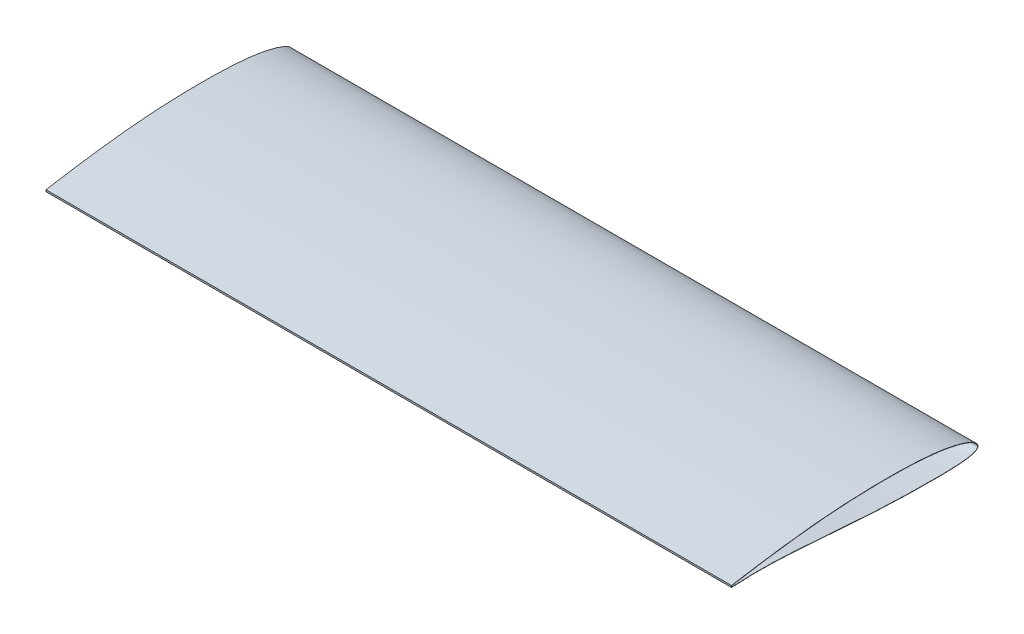
ISO-10303-21;
HEADER;
FILE_DESCRIPTION(('STEP AP214'),'2;1');
FILE_NAME('part.step','',(''),(''),'','','');
FILE_SCHEMA(('AUTOMOTIVE_DESIGN { 1 0 10303 214 1 1 1 1 }'));
ENDSEC;
DATA;
#1=APPLICATION_CONTEXT('core data for automotive mechanical design processes');
#2=APPLICATION_PROTOCOL_DEFINITION('international standard','automotive_design',2000,#1);
#3=PRODUCT_CONTEXT('',#1,'mechanical');
#4=PRODUCT('Part','Part','',(#3));
#5=PRODUCT_RELATED_PRODUCT_CATEGORY('part','',(#4));
#6=PRODUCT_DEFINITION_FORMATION('','',#4);
#7=PRODUCT_DEFINITION_CONTEXT('part definition',#1,'design');
#8=PRODUCT_DEFINITION('design','',#6,#7);
#9=PRODUCT_DEFINITION_SHAPE('','',#8);
#10=(LENGTH_UNIT() NAMED_UNIT(*) SI_UNIT(.MILLI.,.METRE.));
#11=(NAMED_UNIT(*) PLANE_ANGLE_UNIT() SI_UNIT($,.RADIAN.));
#12=(NAMED_UNIT(*) SI_UNIT($,.STERADIAN.) SOLID_ANGLE_UNIT());
#13=UNCERTAINTY_MEASURE_WITH_UNIT(LENGTH_MEASURE(1.E-05),#10,'distance_accuracy_value','');
#14=(GEOMETRIC_REPRESENTATION_CONTEXT(3) GLOBAL_UNCERTAINTY_ASSIGNED_CONTEXT((#13)) GLOBAL_UNIT_ASSIGNED_CONTEXT((#10,
#11,#12)) REPRESENTATION_CONTEXT('',''));
#15=CARTESIAN_POINT('',(0.,0.,0.));
#16=DIRECTION('',(0.,0.,1.));
#17=DIRECTION('',(1.,0.,0.));
#18=AXIS2_PLACEMENT_3D('',#15,#16,#17);
#19=CARTESIAN_POINT('',(660.,1.64115052743639,0.171932989034191));
#20=DIRECTION('',(-1.,0.,0.));
#21=DIRECTION('',(0.,0.,1.));
#22=AXIS2_PLACEMENT_3D('',#19,#20,#21);
#23=PLANE('',#22);
#24=CARTESIAN_POINT('',(660.,0.00851203113730381,250.299879217896));
#25=CARTESIAN_POINT('',(660.,-0.0415942590162992,250.300610440767));
#26=CARTESIAN_POINT('',(660.,-0.152161860770837,250.272506801154));
#27=CARTESIAN_POINT('',(660.,-0.259965331737343,250.167522590776));
#28=CARTESIAN_POINT('',(660.,-0.284593038341012,250.096781737222));
#29=CARTESIAN_POINT('',(660.,-0.295657832195406,250.057124680893));
#30=CARTESIAN_POINT('',(660.,-0.299589513553123,250.026592719769));
#31=CARTESIAN_POINT('',(660.,-0.300788545775397,250.007637867982));
#32=CARTESIAN_POINT('',(660.,-0.301054379074273,249.988212512625));
#33=CARTESIAN_POINT('',(660.,-0.30059721191853,249.972342631143));
#34=CARTESIAN_POINT('',(660.,-0.299715526481863,249.954348045777));
#35=CARTESIAN_POINT('',(660.,-0.298497464499674,249.93549893126));
#36=CARTESIAN_POINT('',(660.,-0.296458505735992,249.907843325712));
#37=CARTESIAN_POINT('',(660.,-0.293133835202882,249.867841257151));
#38=CARTESIAN_POINT('',(660.,-0.287998729290465,249.810943218763));
#39=CARTESIAN_POINT('',(660.,-0.279801997220732,249.724390350209));
#40=CARTESIAN_POINT('',(660.,-0.267388415798908,249.59880987299));
#41=CARTESIAN_POINT('',(660.,-0.25031768000012,249.430459515597));
#42=CARTESIAN_POINT('',(660.,-0.226273804968027,249.195382682965));
#43=CARTESIAN_POINT('',(660.,-0.198009291952686,248.915327795734));
#44=CARTESIAN_POINT('',(660.,-0.168358731904941,248.612353141811));
#45=CARTESIAN_POINT('',(660.,-0.133192974381476,248.242015094353));
#46=CARTESIAN_POINT('',(660.,-0.0964390058673635,247.834242708697));
#47=CARTESIAN_POINT('',(660.,-0.0595236681232221,247.398464530492));
#48=CARTESIAN_POINT('',(660.,-0.01480301413068,246.847910816136));
#49=CARTESIAN_POINT('',(660.,0.0458874341870452,246.111558123038));
#50=CARTESIAN_POINT('',(660.,0.128254179339114,245.137192793484));
#51=CARTESIAN_POINT('',(660.,0.243670253642688,243.772743085392));
#52=CARTESIAN_POINT('',(660.,0.38650761134497,242.03921317083));
#53=CARTESIAN_POINT('',(660.,0.536484673338993,240.063200336767));
#54=CARTESIAN_POINT('',(660.,0.673723383554997,238.119323561757));
#55=CARTESIAN_POINT('',(660.,0.802802158334246,236.16814930186));
#56=CARTESIAN_POINT('',(660.,0.96625171519915,233.536179450592));
#57=CARTESIAN_POINT('',(660.,1.14972586909803,230.220754521479));
#58=CARTESIAN_POINT('',(660.,1.32686721965274,226.261301818986));
#59=CARTESIAN_POINT('',(660.,1.46217380664256,222.310221851806));
#60=CARTESIAN_POINT('',(660.,1.58907599436371,217.034536948074));
#61=CARTESIAN_POINT('',(660.,1.6469298796479,210.429947600971));
#62=CARTESIAN_POINT('',(660.,1.55709956014121,202.510880005302));
#63=CARTESIAN_POINT('',(660.,1.32519296729882,194.592958559664));
#64=CARTESIAN_POINT('',(660.,0.981660944201321,186.677117851058));
#65=CARTESIAN_POINT('',(660.,0.556908077384676,178.765161733083));
#66=CARTESIAN_POINT('',(660.,-0.0953813518286871,168.219890218321));
#67=CARTESIAN_POINT('',(660.,-1.03300992275131,155.045066006488));
#68=CARTESIAN_POINT('',(660.,-2.25260262489353,139.240809074306));
#69=CARTESIAN_POINT('',(660.,-3.47583234832261,123.434827002437));
#70=CARTESIAN_POINT('',(660.,-4.58801164903379,107.618458499));
#71=CARTESIAN_POINT('',(660.,-5.50274193406635,91.7874036901302));
#72=CARTESIAN_POINT('',(660.,-6.1403455161051,75.9420509706974));
#73=CARTESIAN_POINT('',(660.,-6.47354050568013,62.7323307612574));
#74=CARTESIAN_POINT('',(660.,-6.62266457095368,52.1619890918186));
#75=CARTESIAN_POINT('',(660.,-6.67662273312011,44.2337883177737));
#76=CARTESIAN_POINT('',(660.,-6.65180486570018,36.3035722319282));
#77=CARTESIAN_POINT('',(660.,-6.5383913921192,29.6953885399139));
#78=CARTESIAN_POINT('',(660.,-6.36948129754015,24.4096595558014));
#79=CARTESIAN_POINT('',(660.,-6.19087464614657,20.4450845113171));
#80=CARTESIAN_POINT('',(660.,-5.93272568729475,16.4805457366008));
#81=CARTESIAN_POINT('',(660.,-5.60860396178254,13.1862938546496));
#82=CARTESIAN_POINT('',(660.,-5.2491338916079,10.557305657677));
#83=CARTESIAN_POINT('',(660.,-4.92242309276855,8.58672384675019));
#84=CARTESIAN_POINT('',(660.,-4.51037612301015,6.62418506968199));
#85=CARTESIAN_POINT('',(660.,-3.96742217417539,4.70180291861749));
#86=CARTESIAN_POINT('',(660.,-3.36948122727044,3.14556823052178));
#87=CARTESIAN_POINT('',(660.,-2.80392657496438,1.91276072032612));
#88=CARTESIAN_POINT('',(660.,-2.29354760260437,0.982008538494683));
#89=CARTESIAN_POINT('',(660.,-1.55522549396738,0.178982490652044));
#90=CARTESIAN_POINT('',(660.,-0.496131147539051,-0.338488685918497));
#91=CARTESIAN_POINT('',(660.,0.66623021235439,-0.288782614579684));
#92=CARTESIAN_POINT('',(660.,1.66028447300926,0.145287130403116));
#93=CARTESIAN_POINT('',(660.,2.53953506022693,0.739232027172366));
#94=CARTESIAN_POINT('',(660.,3.57641854124955,1.63563228476054));
#95=CARTESIAN_POINT('',(660.,4.6695547992918,2.92702851972945));
#96=CARTESIAN_POINT('',(660.,5.76071964309172,4.63071264774603));
#97=CARTESIAN_POINT('',(660.,7.00300428073947,7.00397618105125));
#98=CARTESIAN_POINT('',(660.,8.27555058181624,10.0760477559024));
#99=CARTESIAN_POINT('',(660.,9.54863179222154,13.8500487910829));
#100=CARTESIAN_POINT('',(660.,10.6446468339172,17.6723181061434));
#101=CARTESIAN_POINT('',(660.,11.6040940057227,21.5281681384073));
#102=CARTESIAN_POINT('',(660.,12.4500429705219,25.4090120272593));
#103=CARTESIAN_POINT('',(660.,13.4442203011166,30.6095562582757));
#104=CARTESIAN_POINT('',(660.,14.4647029262623,37.1477758620433));
#105=CARTESIAN_POINT('',(660.,15.389882750319,45.0316530020749));
#106=CARTESIAN_POINT('',(660.,16.0751673303074,52.9375622296353));
#107=CARTESIAN_POINT('',(660.,16.717282738099,63.4965273693013));
#108=CARTESIAN_POINT('',(660.,17.1232341843218,76.7106493306953));
#109=CARTESIAN_POINT('',(660.,17.1665689752416,92.5715622604681));
#110=CARTESIAN_POINT('',(660.,16.8536913769647,108.428137058977));
#111=CARTESIAN_POINT('',(660.,16.2031863115242,124.274557363491));
#112=CARTESIAN_POINT('',(660.,15.2035262569515,140.103392113993));
#113=CARTESIAN_POINT('',(660.,13.8412029927248,155.904723236483));
#114=CARTESIAN_POINT('',(660.,12.4307180655359,169.045219163134));
#115=CARTESIAN_POINT('',(660.,11.1567106146635,179.539970397058));
#116=CARTESIAN_POINT('',(660.,10.1363332211165,187.402578879519));
#117=CARTESIAN_POINT('',(660.,9.05647641624516,195.257205957175));
#118=CARTESIAN_POINT('',(660.,7.91030198513163,203.102654505584));
#119=CARTESIAN_POINT('',(660.,6.9341104582187,209.634889855681));
#120=CARTESIAN_POINT('',(660.,6.12428239086284,214.859058701329));
#121=CARTESIAN_POINT('',(660.,5.48260716601222,218.773874391536));
#122=CARTESIAN_POINT('',(660.,4.82875900695875,222.68293450718));
#123=CARTESIAN_POINT('',(660.,4.20774534932606,226.588844765037));
#124=CARTESIAN_POINT('',(660.,3.60557746178636,230.501835449157));
#125=CARTESIAN_POINT('',(660.,3.07275233506809,233.781525609078));
#126=CARTESIAN_POINT('',(660.,2.63110552351447,236.392965845949));
#127=CARTESIAN_POINT('',(660.,2.29774313988503,238.333354657877));
#128=CARTESIAN_POINT('',(660.,1.96460897495937,240.252683871098));
#129=CARTESIAN_POINT('',(660.,1.62649118011434,242.193677466078));
#130=CARTESIAN_POINT('',(660.,1.3318083301473,243.894652446307));
#131=CARTESIAN_POINT('',(660.,1.09666527197546,245.252120397561));
#132=CARTESIAN_POINT('',(660.,0.927374906918746,246.224060084316));
#133=CARTESIAN_POINT('',(660.,0.796992844238262,246.962025587189));
#134=CARTESIAN_POINT('',(660.,0.700103889784776,247.506780942721));
#135=CARTESIAN_POINT('',(660.,0.626247063403914,247.934491212951));
#136=CARTESIAN_POINT('',(660.,0.547252532052911,248.414721591915));
#137=CARTESIAN_POINT('',(660.,0.473912491142221,248.88621611927));
#138=CARTESIAN_POINT('',(660.,0.416437297216251,249.272448082603));
#139=CARTESIAN_POINT('',(660.,0.382284542223371,249.505498980371));
#140=CARTESIAN_POINT('',(660.,0.357670364391624,249.672888150817));
#141=CARTESIAN_POINT('',(660.,0.33523840660703,249.823102083426));
#142=CARTESIAN_POINT('',(660.,0.319429054490912,249.925200337912));
#143=CARTESIAN_POINT('',(660.,0.308881064404215,249.989180993184));
#144=CARTESIAN_POINT('',(660.,0.303156345245627,250.021549375076));
#145=CARTESIAN_POINT('',(660.,0.29848702773046,250.045077431635));
#146=CARTESIAN_POINT('',(660.,0.295141094374167,250.06041868433));
#147=CARTESIAN_POINT('',(660.,0.290475070287641,250.078197565358));
#148=CARTESIAN_POINT('',(660.,0.285375112196109,250.094934342959));
#149=CARTESIAN_POINT('',(660.,0.275869265378229,250.119839811538));
#150=CARTESIAN_POINT('',(660.,0.260523409786759,250.150358902535));
#151=CARTESIAN_POINT('',(660.,0.230138400144907,250.199654855489));
#152=CARTESIAN_POINT('',(660.,0.148475880150781,250.268119463925));
#153=CARTESIAN_POINT('',(660.,0.0586183212909068,250.299147995024));
#154=CARTESIAN_POINT('',(660.,0.00851203113730381,250.299879217896));
#155=B_SPLINE_CURVE_WITH_KNOTS('',3,(#24,#25,#26,#27,#28,#29,#30,#31,#32,#33,#34,#35,#36,#37,
#38,#39,#40,#41,#42,#43,#44,#45,#46,#47,#48,#49,#50,#51,#52,#53,#54,#55,#56,#57,#58,#59,#60,#61,
#62,#63,#64,#65,#66,#67,#68,#69,#70,#71,#72,#73,#74,#75,#76,#77,#78,#79,#80,#81,#82,#83,#84,#85,
#86,#87,#88,#89,#90,#91,#92,#93,#94,#95,#96,#97,#98,#99,#100,#101,#102,#103,#104,#105,#106,#107,
#108,#109,#110,#111,#112,#113,#114,#115,#116,#117,#118,#119,#120,#121,#122,#123,#124,#125,#126,
#127,#128,#129,#130,#131,#132,#133,#134,#135,#136,#137,#138,#139,#140,#141,#142,#143,#144,#145,
#146,#147,#148,#149,#150,#151,#152,#153,#154),.UNSPECIFIED.,.T.,.F.,(4,1,1,1,1,1,1,1,1,1,1,1,1,
1,1,1,1,1,1,1,1,1,1,1,1,1,1,1,1,1,1,1,1,1,1,1,1,1,1,1,1,1,1,1,1,1,1,1,1,1,1,1,1,1,1,1,1,1,1,1,1,
1,1,1,1,1,1,1,1,1,1,1,1,1,1,1,1,1,1,1,1,1,1,1,1,1,1,1,1,1,1,1,1,1,1,1,1,1,1,1,1,1,1,1,1,1,1,1,1,
1,1,1,1,1,1,1,1,1,1,1,1,1,1,1,1,1,1,1,4),(0.,7.62939453125E-06,1.52587890625E-05,
3.0517578125E-05,4.57763671875E-05,6.103515625E-05,9.1552734375E-05,0.0001220703125,
0.00018310546875,0.000244140625,0.00030517578125,0.0003662109375,0.00048828125,0.0006103515625,
0.000732421875,0.0009765625,0.001220703125,0.00146484375,0.001953125,0.00244140625,0.0029296875,
0.00390625,0.0048828125,0.005859375,0.0078125,0.009765625,0.01171875,0.015625,0.01953125,
0.0234375,0.02734375,0.03125,0.0390625,0.046875,0.0546875,0.0625,0.078125,0.09375,0.109375,
0.125,0.140625,0.15625,0.1875,0.21875,0.25,0.28125,0.3125,0.34375,0.375,0.390625,0.40625,
0.421875,0.4375,0.4453125,0.453125,0.4609375,0.46875,0.47265625,0.4765625,0.48046875,0.484375,
0.48828125,0.490234375,0.4921875,0.494140625,0.49609375,0.498046875,0.5,0.501953125,0.50390625,
0.5078125,0.51171875,0.515625,0.5234375,0.53125,0.5390625,0.546875,0.5546875,0.5625,0.578125,
0.59375,0.609375,0.625,0.65625,0.6875,0.71875,0.75,0.78125,0.8125,0.84375,0.859375,0.875,
0.890625,0.90625,0.921875,0.9296875,0.9375,0.9453125,0.953125,0.9609375,0.96875,0.97265625,
0.9765625,0.98046875,0.984375,0.98828125,0.990234375,0.9921875,0.994140625,0.9951171875,
0.99609375,0.9970703125,0.998046875,0.99853515625,0.998779296875,0.9990234375,0.999267578125,
0.99951171875,0.9996337890625,0.999755859375,0.99981689453125,0.9998779296875,0.999908447265625,
0.99993896484375,0.999954223632812,0.999969482421875,0.999984741210938,0.999992370605469,1.),.UNSPECIFIED.);
#156=CARTESIAN_POINT('',(660.,0.770284292098685,236.650797006792));
#157=VERTEX_POINT('',#156);
#158=CARTESIAN_POINT('',(660.,2.51868264714181,237.045729829817));
#159=VERTEX_POINT('',#158);
#160=EDGE_CURVE('E120',#157,#159,#155,.T.);
#161=ORIENTED_EDGE('',*,*,#160,.T.);
#162=DIRECTION('',(0.,-0.998451108391889,-0.0556361766390155));
#163=VECTOR('',#162,1.);
#164=CARTESIAN_POINT('',(660.,-13.1600945307642,236.172069407968));
#165=LINE('',#164,#163);
#166=CARTESIAN_POINT('',(660.0025,2.21720517010672,237.028930755708));
#167=VERTEX_POINT('',#166);
#168=EDGE_CURVE('E113',#159,#167,#165,.T.);
#169=ORIENTED_EDGE('',*,*,#168,.T.);
#170=CARTESIAN_POINT('',(660.005,2.26814469832966,236.731303844471));
#171=DIRECTION('',(0.,-0.168699264399906,0.985667569818004));
#172=VECTOR('',#171,1.);
#173=LINE('',#170,#172);
#174=CARTESIAN_POINT('',(660.002495206962,2.26813996456746,236.731303036409));
#175=VERTEX_POINT('',#174);
#176=EDGE_CURVE('E95',#175,#167,#173,.T.);
#177=ORIENTED_EDGE('',*,*,#176,.F.);
#178=CARTESIAN_POINT('',(660.,1.07000336824573,236.664540432712));
#179=CARTESIAN_POINT('',(660.,1.20938711733215,234.52568603359));
#180=CARTESIAN_POINT('',(660.,1.50516401144657,229.475821130915));
#181=CARTESIAN_POINT('',(660.,1.8232186026768,221.18415869828));
#182=CARTESIAN_POINT('',(660.,1.96762610068065,211.337618207726));
#183=CARTESIAN_POINT('',(660.,1.83322105638369,200.371188527109));
#184=CARTESIAN_POINT('',(660.,1.38960528984164,188.499913622482));
#185=CARTESIAN_POINT('',(660.,0.706014078000893,175.953687417433));
#186=CARTESIAN_POINT('',(660.,-0.160208641561513,162.931424917666));
#187=CARTESIAN_POINT('',(660.,-1.14801632724376,149.615771743617));
#188=CARTESIAN_POINT('',(660.,-2.19092490983926,136.176354994724));
#189=CARTESIAN_POINT('',(660.,-3.21958397917046,122.767140548026));
#190=CARTESIAN_POINT('',(660.,-4.15274312671142,109.520053587455));
#191=CARTESIAN_POINT('',(660.,-4.93856436487493,96.5460959745437));
#192=CARTESIAN_POINT('',(660.,-5.53683070268675,83.9408193016427));
#193=CARTESIAN_POINT('',(660.,-5.94764820461108,71.8018392906514));
#194=CARTESIAN_POINT('',(660.,-6.21845093878312,60.2452560030716));
#195=CARTESIAN_POINT('',(660.,-6.35536975583973,49.3987328907547));
#196=CARTESIAN_POINT('',(660.,-6.38138796281789,39.3972261942655));
#197=CARTESIAN_POINT('',(660.,-6.26504923032313,30.3619348419668));
#198=CARTESIAN_POINT('',(660.,-6.01216491688521,22.4121811031587));
#199=CARTESIAN_POINT('',(660.,-5.59743390072595,15.6262272306516));
#200=CARTESIAN_POINT('',(660.,-4.92870657935606,10.0719075109048));
#201=CARTESIAN_POINT('',(660.,-4.04044698146404,5.69769261214423));
#202=CARTESIAN_POINT('',(660.,-2.8657529844069,2.62532063874475));
#203=CARTESIAN_POINT('',(660.,-1.7115284699546,0.494884225045661));
#204=CARTESIAN_POINT('',(660.,-0.410454230626488,-0.0213125491030087));
#205=CARTESIAN_POINT('',(660.,0.792659826704065,0.0311691995850224));
#206=CARTESIAN_POINT('',(660.,2.30568433693192,0.812599241892923));
#207=CARTESIAN_POINT('',(660.,4.23835242447377,2.72886351673443));
#208=CARTESIAN_POINT('',(660.,6.11817212106947,5.76990724125498));
#209=CARTESIAN_POINT('',(660.,7.91359420170391,9.88094280419771));
#210=CARTESIAN_POINT('',(660.,9.64131817838287,15.0749304677094));
#211=CARTESIAN_POINT('',(660.,11.2838964878058,21.2987522216172));
#212=CARTESIAN_POINT('',(660.,12.7883817585812,28.4971721202648));
#213=CARTESIAN_POINT('',(660.,14.0978349081275,36.6073734062479));
#214=CARTESIAN_POINT('',(660.,15.1594290171638,45.573028440303));
#215=CARTESIAN_POINT('',(660.,15.9609039979753,55.3329100744701));
#216=CARTESIAN_POINT('',(660.,16.4940697383882,65.8165364983871));
#217=CARTESIAN_POINT('',(660.,16.7919897051422,76.9313762604552));
#218=CARTESIAN_POINT('',(660.,16.864754130909,88.5669490281142));
#219=CARTESIAN_POINT('',(660.,16.7267152914356,100.596999885542));
#220=CARTESIAN_POINT('',(660.,16.3833850637257,112.888825982424));
#221=CARTESIAN_POINT('',(660.,15.825573666627,125.31161581915));
#222=CARTESIAN_POINT('',(660.,15.0523318700684,137.743791097076));
#223=CARTESIAN_POINT('',(660.,14.0593390742259,150.072384382085));
#224=CARTESIAN_POINT('',(660.,12.8815869860292,162.191375055682));
#225=CARTESIAN_POINT('',(660.,11.5492803460744,173.989074322246));
#226=CARTESIAN_POINT('',(660.,10.1162497290333,185.35236444642));
#227=CARTESIAN_POINT('',(660.,8.63237912523508,196.163081697706));
#228=CARTESIAN_POINT('',(660.,7.13151388385034,206.300441402258));
#229=CARTESIAN_POINT('',(660.,5.73122176805054,215.560350587015));
#230=CARTESIAN_POINT('',(660.,4.29329512716244,223.97715704258));
#231=CARTESIAN_POINT('',(660.,3.25193510165877,230.897397413297));
#232=CARTESIAN_POINT('',(660.,2.54483353426828,235.112832904621));
#233=CARTESIAN_POINT('',(660.,2.2681446981295,236.731303845642));
#234=B_SPLINE_CURVE_WITH_KNOTS('',3,(#178,#179,#180,#181,#182,#183,#184,#185,#186,#187,#188,
#189,#190,#191,#192,#193,#194,#195,#196,#197,#198,#199,#200,#201,#202,#203,#204,#205,#206,#207,
#208,#209,#210,#211,#212,#213,#214,#215,#216,#217,#218,#219,#220,#221,#222,#223,#224,#225,#226,
#227,#228,#229,#230,#231,#232,#233),.UNSPECIFIED.,.F.,.F.,(4,1,1,1,1,1,1,1,1,1,1,1,1,1,1,1,1,1,
1,1,1,1,1,1,1,1,1,1,1,1,1,1,1,1,1,1,1,1,1,1,1,1,1,1,1,1,1,1,1,1,1,1,1,4),(0.0263864426753588,
0.0391734833267743,0.0560606311759249,0.0755789238487882,0.0973636066296903,0.120926258366677,
0.145825281006277,0.171670911815127,0.198108536705041,0.22479018357162,0.25139057978404,
0.277643490654311,0.303326750051388,0.328257458029316,0.352272548115194,0.375156061746876,
0.396620664402003,0.416422729294005,0.434304420097656,0.450054679859308,0.463465465082325,
0.474478994238096,0.483169222153171,0.489678354497499,0.494104066315722,0.496910015324886,
0.497289784891853,0.501214273282496,0.506457950332762,0.51335695674223,0.522168631834455,
0.53296596992453,0.545689209241574,0.56022077890382,0.57643892310517,0.594258689005965,
0.613600244568652,0.634342385932902,0.656331109263004,0.679351893859712,0.703152302846811,
0.727478208080039,0.7520707394079,0.776691163534608,0.801140183976245,0.825214386971546,
0.848697423570622,0.871352857669295,0.892947448931157,0.913230871058069,0.931955467148994,
0.94834206907442,0.963693004275676,0.973442162584554),.UNSPECIFIED.);
#235=CARTESIAN_POINT('',(660.002498020791,1.07000139166205,236.664540303903));
#236=VERTEX_POINT('',#235);
#237=EDGE_CURVE('E178',#236,#175,#234,.T.);
#238=ORIENTED_EDGE('',*,*,#237,.F.);
#239=CARTESIAN_POINT('',(660.005,1.05040053338072,236.963913482786));
#240=DIRECTION('',(0.,0.0653396995590158,-0.997863078614264));
#241=VECTOR('',#240,1.);
#242=LINE('',#239,#241);
#243=CARTESIAN_POINT('',(660.0025,1.05040053274584,236.963913492436));
#244=VERTEX_POINT('',#243);
#245=EDGE_CURVE('E168',#244,#236,#242,.T.);
#246=ORIENTED_EDGE('',*,*,#245,.F.);
#247=CARTESIAN_POINT('',(660.,0.750882575448525,236.94722361732));
#248=VERTEX_POINT('',#247);
#249=EDGE_CURVE('E116',#244,#248,#165,.T.);
#250=ORIENTED_EDGE('',*,*,#249,.T.);
#251=CARTESIAN_POINT('',(660.,0.75107742520369,236.944260895981));
#252=VERTEX_POINT('',#251);
#253=EDGE_CURVE('E11',#248,#252,#155,.T.);
#254=ORIENTED_EDGE('',*,*,#253,.T.);
#255=CARTESIAN_POINT('',(660.,0.770284292098684,236.650797006792));
#256=CARTESIAN_POINT('',(660.,0.763908222943131,236.748686502756));
#257=CARTESIAN_POINT('',(660.,0.757506246979694,236.846504890078));
#258=CARTESIAN_POINT('',(660.,0.75107742520369,236.944260895981));
#259=B_SPLINE_CURVE_WITH_KNOTS('',3,(#255,#256,#257,#258),.UNSPECIFIED.,.F.,.F.,(4,4),
(0.0257881631056029,0.0263742192154904),.UNSPECIFIED.);
#260=EDGE_CURVE('E44',#252,#157,#259,.F.);
#261=ORIENTED_EDGE('',*,*,#260,.T.);
#262=EDGE_LOOP('',(#161,#169,#177,#238,#246,#250,#254,#261));
#263=FACE_BOUND('',#262,.T.);
#264=ADVANCED_FACE('F32',(#263),#23,.F.);
#265=CARTESIAN_POINT('',(0.,1.64115052743639,0.171932989034191));
#266=DIRECTION('',(-1.,0.,0.));
#267=DIRECTION('',(0.,0.,1.));
#268=AXIS2_PLACEMENT_3D('',#265,#266,#267);
#269=PLANE('',#268);
#270=DIRECTION('',(0.,-0.998451108391889,-0.0556361766390155));
#271=VECTOR('',#270,1.);
#272=CARTESIAN_POINT('',(0.,-13.1600945307642,236.172069407968));
#273=LINE('',#272,#271);
#274=CARTESIAN_POINT('',(0.,2.51868264714181,237.045729829817));
#275=VERTEX_POINT('',#274);
#276=CARTESIAN_POINT('',(0.,0.750882575448525,236.94722361732));
#277=VERTEX_POINT('',#276);
#278=EDGE_CURVE('E125',#275,#277,#273,.T.);
#279=ORIENTED_EDGE('',*,*,#278,.F.);
#280=CARTESIAN_POINT('',(0.,0.00851203113730381,250.299879217896));
#281=CARTESIAN_POINT('',(0.,-0.0415942590162992,250.300610440767));
#282=CARTESIAN_POINT('',(0.,-0.152161860770837,250.272506801154));
#283=CARTESIAN_POINT('',(0.,-0.259965331737343,250.167522590776));
#284=CARTESIAN_POINT('',(0.,-0.284593038341012,250.096781737222));
#285=CARTESIAN_POINT('',(0.,-0.295657832195406,250.057124680893));
#286=CARTESIAN_POINT('',(0.,-0.299589513553123,250.026592719769));
#287=CARTESIAN_POINT('',(0.,-0.300788545775397,250.007637867982));
#288=CARTESIAN_POINT('',(0.,-0.301054379074273,249.988212512625));
#289=CARTESIAN_POINT('',(0.,-0.30059721191853,249.972342631143));
#290=CARTESIAN_POINT('',(0.,-0.299715526481863,249.954348045777));
#291=CARTESIAN_POINT('',(0.,-0.298497464499674,249.93549893126));
#292=CARTESIAN_POINT('',(0.,-0.296458505735992,249.907843325712));
#293=CARTESIAN_POINT('',(0.,-0.293133835202882,249.867841257151));
#294=CARTESIAN_POINT('',(0.,-0.287998729290465,249.810943218763));
#295=CARTESIAN_POINT('',(0.,-0.279801997220732,249.724390350209));
#296=CARTESIAN_POINT('',(0.,-0.267388415798908,249.59880987299));
#297=CARTESIAN_POINT('',(0.,-0.25031768000012,249.430459515597));
#298=CARTESIAN_POINT('',(0.,-0.226273804968027,249.195382682965));
#299=CARTESIAN_POINT('',(0.,-0.198009291952686,248.915327795734));
#300=CARTESIAN_POINT('',(0.,-0.168358731904941,248.612353141811));
#301=CARTESIAN_POINT('',(0.,-0.133192974381476,248.242015094353));
#302=CARTESIAN_POINT('',(0.,-0.0964390058673635,247.834242708697));
#303=CARTESIAN_POINT('',(0.,-0.0595236681232221,247.398464530492));
#304=CARTESIAN_POINT('',(0.,-0.01480301413068,246.847910816136));
#305=CARTESIAN_POINT('',(0.,0.0458874341870452,246.111558123038));
#306=CARTESIAN_POINT('',(0.,0.128254179339114,245.137192793484));
#307=CARTESIAN_POINT('',(0.,0.243670253642688,243.772743085392));
#308=CARTESIAN_POINT('',(0.,0.38650761134497,242.03921317083));
#309=CARTESIAN_POINT('',(0.,0.536484673338993,240.063200336767));
#310=CARTESIAN_POINT('',(0.,0.673723383554997,238.119323561757));
#311=CARTESIAN_POINT('',(0.,0.802802158334246,236.16814930186));
#312=CARTESIAN_POINT('',(0.,0.96625171519915,233.536179450592));
#313=CARTESIAN_POINT('',(0.,1.14972586909803,230.220754521479));
#314=CARTESIAN_POINT('',(0.,1.32686721965274,226.261301818986));
#315=CARTESIAN_POINT('',(0.,1.46217380664256,222.310221851806));
#316=CARTESIAN_POINT('',(0.,1.58907599436371,217.034536948074));
#317=CARTESIAN_POINT('',(0.,1.6469298796479,210.429947600971));
#318=CARTESIAN_POINT('',(0.,1.55709956014121,202.510880005302));
#319=CARTESIAN_POINT('',(0.,1.32519296729882,194.592958559664));
#320=CARTESIAN_POINT('',(0.,0.981660944201321,186.677117851058));
#321=CARTESIAN_POINT('',(0.,0.556908077384676,178.765161733083));
#322=CARTESIAN_POINT('',(0.,-0.0953813518286871,168.219890218321));
#323=CARTESIAN_POINT('',(0.,-1.03300992275131,155.045066006488));
#324=CARTESIAN_POINT('',(0.,-2.25260262489353,139.240809074306));
#325=CARTESIAN_POINT('',(0.,-3.47583234832261,123.434827002437));
#326=CARTESIAN_POINT('',(0.,-4.58801164903379,107.618458499));
#327=CARTESIAN_POINT('',(0.,-5.50274193406635,91.7874036901302));
#328=CARTESIAN_POINT('',(0.,-6.1403455161051,75.9420509706974));
#329=CARTESIAN_POINT('',(0.,-6.47354050568013,62.7323307612574));
#330=CARTESIAN_POINT('',(0.,-6.62266457095368,52.1619890918186));
#331=CARTESIAN_POINT('',(0.,-6.67662273312011,44.2337883177737));
#332=CARTESIAN_POINT('',(0.,-6.65180486570018,36.3035722319282));
#333=CARTESIAN_POINT('',(0.,-6.5383913921192,29.6953885399139));
#334=CARTESIAN_POINT('',(0.,-6.36948129754015,24.4096595558014));
#335=CARTESIAN_POINT('',(0.,-6.19087464614657,20.4450845113171));
#336=CARTESIAN_POINT('',(0.,-5.93272568729475,16.4805457366008));
#337=CARTESIAN_POINT('',(0.,-5.60860396178254,13.1862938546496));
#338=CARTESIAN_POINT('',(0.,-5.2491338916079,10.557305657677));
#339=CARTESIAN_POINT('',(0.,-4.92242309276855,8.58672384675019));
#340=CARTESIAN_POINT('',(0.,-4.51037612301015,6.62418506968199));
#341=CARTESIAN_POINT('',(0.,-3.96742217417539,4.70180291861749));
#342=CARTESIAN_POINT('',(0.,-3.36948122727044,3.14556823052178));
#343=CARTESIAN_POINT('',(0.,-2.80392657496438,1.91276072032612));
#344=CARTESIAN_POINT('',(0.,-2.29354760260437,0.982008538494683));
#345=CARTESIAN_POINT('',(0.,-1.55522549396738,0.178982490652044));
#346=CARTESIAN_POINT('',(0.,-0.496131147539051,-0.338488685918497));
#347=CARTESIAN_POINT('',(0.,0.66623021235439,-0.288782614579684));
#348=CARTESIAN_POINT('',(0.,1.66028447300926,0.145287130403116));
#349=CARTESIAN_POINT('',(0.,2.53953506022693,0.739232027172366));
#350=CARTESIAN_POINT('',(0.,3.57641854124955,1.63563228476054));
#351=CARTESIAN_POINT('',(0.,4.6695547992918,2.92702851972945));
#352=CARTESIAN_POINT('',(0.,5.76071964309172,4.63071264774603));
#353=CARTESIAN_POINT('',(0.,7.00300428073947,7.00397618105125));
#354=CARTESIAN_POINT('',(0.,8.27555058181624,10.0760477559024));
#355=CARTESIAN_POINT('',(0.,9.54863179222154,13.8500487910829));
#356=CARTESIAN_POINT('',(0.,10.6446468339172,17.6723181061434));
#357=CARTESIAN_POINT('',(0.,11.6040940057227,21.5281681384073));
#358=CARTESIAN_POINT('',(0.,12.4500429705219,25.4090120272593));
#359=CARTESIAN_POINT('',(0.,13.4442203011166,30.6095562582757));
#360=CARTESIAN_POINT('',(0.,14.4647029262623,37.1477758620433));
#361=CARTESIAN_POINT('',(0.,15.389882750319,45.0316530020749));
#362=CARTESIAN_POINT('',(0.,16.0751673303074,52.9375622296353));
#363=CARTESIAN_POINT('',(0.,16.717282738099,63.4965273693013));
#364=CARTESIAN_POINT('',(0.,17.1232341843218,76.7106493306953));
#365=CARTESIAN_POINT('',(0.,17.1665689752416,92.5715622604681));
#366=CARTESIAN_POINT('',(0.,16.8536913769647,108.428137058977));
#367=CARTESIAN_POINT('',(0.,16.2031863115242,124.274557363491));
#368=CARTESIAN_POINT('',(0.,15.2035262569515,140.103392113993));
#369=CARTESIAN_POINT('',(0.,13.8412029927248,155.904723236483));
#370=CARTESIAN_POINT('',(0.,12.4307180655359,169.045219163134));
#371=CARTESIAN_POINT('',(0.,11.1567106146635,179.539970397058));
#372=CARTESIAN_POINT('',(0.,10.1363332211165,187.402578879519));
#373=CARTESIAN_POINT('',(0.,9.05647641624516,195.257205957175));
#374=CARTESIAN_POINT('',(0.,7.91030198513163,203.102654505584));
#375=CARTESIAN_POINT('',(0.,6.9341104582187,209.634889855681));
#376=CARTESIAN_POINT('',(0.,6.12428239086284,214.859058701329));
#377=CARTESIAN_POINT('',(0.,5.48260716601222,218.773874391536));
#378=CARTESIAN_POINT('',(0.,4.82875900695875,222.68293450718));
#379=CARTESIAN_POINT('',(0.,4.20774534932606,226.588844765037));
#380=CARTESIAN_POINT('',(0.,3.60557746178636,230.501835449157));
#381=CARTESIAN_POINT('',(0.,3.07275233506809,233.781525609078));
#382=CARTESIAN_POINT('',(0.,2.63110552351447,236.392965845949));
#383=CARTESIAN_POINT('',(0.,2.29774313988503,238.333354657877));
#384=CARTESIAN_POINT('',(0.,1.96460897495937,240.252683871098));
#385=CARTESIAN_POINT('',(0.,1.62649118011434,242.193677466078));
#386=CARTESIAN_POINT('',(0.,1.3318083301473,243.894652446307));
#387=CARTESIAN_POINT('',(0.,1.09666527197546,245.252120397561));
#388=CARTESIAN_POINT('',(0.,0.927374906918746,246.224060084316));
#389=CARTESIAN_POINT('',(0.,0.796992844238262,246.962025587189));
#390=CARTESIAN_POINT('',(0.,0.700103889784776,247.506780942721));
#391=CARTESIAN_POINT('',(0.,0.626247063403914,247.934491212951));
#392=CARTESIAN_POINT('',(0.,0.547252532052911,248.414721591915));
#393=CARTESIAN_POINT('',(0.,0.473912491142221,248.88621611927));
#394=CARTESIAN_POINT('',(0.,0.416437297216251,249.272448082603));
#395=CARTESIAN_POINT('',(0.,0.382284542223371,249.505498980371));
#396=CARTESIAN_POINT('',(0.,0.357670364391624,249.672888150817));
#397=CARTESIAN_POINT('',(0.,0.33523840660703,249.823102083426));
#398=CARTESIAN_POINT('',(0.,0.319429054490912,249.925200337912));
#399=CARTESIAN_POINT('',(0.,0.308881064404215,249.989180993184));
#400=CARTESIAN_POINT('',(0.,0.303156345245627,250.021549375076));
#401=CARTESIAN_POINT('',(0.,0.29848702773046,250.045077431635));
#402=CARTESIAN_POINT('',(0.,0.295141094374167,250.06041868433));
#403=CARTESIAN_POINT('',(0.,0.290475070287641,250.078197565358));
#404=CARTESIAN_POINT('',(0.,0.285375112196109,250.094934342959));
#405=CARTESIAN_POINT('',(0.,0.275869265378229,250.119839811538));
#406=CARTESIAN_POINT('',(0.,0.260523409786759,250.150358902535));
#407=CARTESIAN_POINT('',(0.,0.230138400144907,250.199654855489));
#408=CARTESIAN_POINT('',(0.,0.148475880150781,250.268119463925));
#409=CARTESIAN_POINT('',(0.,0.0586183212909068,250.299147995024));
#410=CARTESIAN_POINT('',(0.,0.00851203113730381,250.299879217896));
#411=B_SPLINE_CURVE_WITH_KNOTS('',3,(#280,#281,#282,#283,#284,#285,#286,#287,#288,#289,#290,
#291,#292,#293,#294,#295,#296,#297,#298,#299,#300,#301,#302,#303,#304,#305,#306,#307,#308,#309,
#310,#311,#312,#313,#314,#315,#316,#317,#318,#319,#320,#321,#322,#323,#324,#325,#326,#327,#328,
#329,#330,#331,#332,#333,#334,#335,#336,#337,#338,#339,#340,#341,#342,#343,#344,#345,#346,#347,
#348,#349,#350,#351,#352,#353,#354,#355,#356,#357,#358,#359,#360,#361,#362,#363,#364,#365,#366,
#367,#368,#369,#370,#371,#372,#373,#374,#375,#376,#377,#378,#379,#380,#381,#382,#383,#384,#385,
#386,#387,#388,#389,#390,#391,#392,#393,#394,#395,#396,#397,#398,#399,#400,#401,#402,#403,#404,
#405,#406,#407,#408,#409,#410),.UNSPECIFIED.,.T.,.F.,(4,1,1,1,1,1,1,1,1,1,1,1,1,1,1,1,1,1,1,1,1,
1,1,1,1,1,1,1,1,1,1,1,1,1,1,1,1,1,1,1,1,1,1,1,1,1,1,1,1,1,1,1,1,1,1,1,1,1,1,1,1,1,1,1,1,1,1,1,1,
1,1,1,1,1,1,1,1,1,1,1,1,1,1,1,1,1,1,1,1,1,1,1,1,1,1,1,1,1,1,1,1,1,1,1,1,1,1,1,1,1,1,1,1,1,1,1,1,
1,1,1,1,1,1,1,1,1,1,1,4),(0.,7.62939453125E-06,1.52587890625E-05,3.0517578125E-05,
4.57763671875E-05,6.103515625E-05,9.1552734375E-05,0.0001220703125,0.00018310546875,
0.000244140625,0.00030517578125,0.0003662109375,0.00048828125,0.0006103515625,0.000732421875,
0.0009765625,0.001220703125,0.00146484375,0.001953125,0.00244140625,0.0029296875,0.00390625,
0.0048828125,0.005859375,0.0078125,0.009765625,0.01171875,0.015625,0.01953125,0.0234375,
0.02734375,0.03125,0.0390625,0.046875,0.0546875,0.0625,0.078125,0.09375,0.109375,0.125,0.140625,
0.15625,0.1875,0.21875,0.25,0.28125,0.3125,0.34375,0.375,0.390625,0.40625,0.421875,0.4375,
0.4453125,0.453125,0.4609375,0.46875,0.47265625,0.4765625,0.48046875,0.484375,0.48828125,
0.490234375,0.4921875,0.494140625,0.49609375,0.498046875,0.5,0.501953125,0.50390625,0.5078125,
0.51171875,0.515625,0.5234375,0.53125,0.5390625,0.546875,0.5546875,0.5625,0.578125,0.59375,
0.609375,0.625,0.65625,0.6875,0.71875,0.75,0.78125,0.8125,0.84375,0.859375,0.875,0.890625,
0.90625,0.921875,0.9296875,0.9375,0.9453125,0.953125,0.9609375,0.96875,0.97265625,0.9765625,
0.98046875,0.984375,0.98828125,0.990234375,0.9921875,0.994140625,0.9951171875,0.99609375,
0.9970703125,0.998046875,0.99853515625,0.998779296875,0.9990234375,0.999267578125,0.99951171875,
0.9996337890625,0.999755859375,0.99981689453125,0.9998779296875,0.999908447265625,
0.99993896484375,0.999954223632812,0.999969482421875,0.999984741210938,0.999992370605469,1.),.UNSPECIFIED.);
#412=CARTESIAN_POINT('',(0.,0.770284292098685,236.650797006792));
#413=VERTEX_POINT('',#412);
#414=EDGE_CURVE('E59',#413,#275,#411,.T.);
#415=ORIENTED_EDGE('',*,*,#414,.F.);
#416=CARTESIAN_POINT('',(1.11022302462516E-13,0.75107742520369,236.944260895981));
#417=CARTESIAN_POINT('',(0.,0.757506246979694,236.846504890078));
#418=CARTESIAN_POINT('',(0.,0.763908222943131,236.748686502756));
#419=CARTESIAN_POINT('',(0.,0.770284292098684,236.650797006792));
#420=B_SPLINE_CURVE_WITH_KNOTS('',3,(#416,#417,#418,#419),.UNSPECIFIED.,.F.,.F.,(4,4),
(0.0257881631056029,0.0263742192154904),.UNSPECIFIED.);
#421=CARTESIAN_POINT('',(0.,0.75107742520369,236.944260895981));
#422=VERTEX_POINT('',#421);
#423=EDGE_CURVE('E242',#422,#413,#420,.T.);
#424=ORIENTED_EDGE('',*,*,#423,.F.);
#425=EDGE_CURVE('E233',#277,#422,#411,.T.);
#426=ORIENTED_EDGE('',*,*,#425,.F.);
#427=EDGE_LOOP('',(#279,#415,#424,#426));
#428=FACE_BOUND('',#427,.T.);
#429=CARTESIAN_POINT('',(0.,0.,250.));
#430=CARTESIAN_POINT('',(0.,-0.0080427959719715,250.000228293678));
#431=CARTESIAN_POINT('',(0.,0.172375657967406,248.284955515532));
#432=CARTESIAN_POINT('',(0.,0.308690014795419,246.518112419387));
#433=CARTESIAN_POINT('',(0.,0.685693593852336,242.189387343398));
#434=CARTESIAN_POINT('',(0.,1.07410152891603,236.806461263496));
#435=CARTESIAN_POINT('',(0.,1.49731723995003,229.680385951639));
#436=CARTESIAN_POINT('',(0.,1.8232186026768,221.18415869828));
#437=CARTESIAN_POINT('',(0.,1.96762610068065,211.337618207726));
#438=CARTESIAN_POINT('',(0.,1.83322105638369,200.371188527109));
#439=CARTESIAN_POINT('',(0.,1.38960528984164,188.499913622482));
#440=CARTESIAN_POINT('',(0.,0.706014078000893,175.953687417433));
#441=CARTESIAN_POINT('',(0.,-0.160208641561513,162.931424917666));
#442=CARTESIAN_POINT('',(0.,-1.14801632724376,149.615771743617));
#443=CARTESIAN_POINT('',(0.,-2.19092490983926,136.176354994724));
#444=CARTESIAN_POINT('',(0.,-3.21958397917046,122.767140548026));
#445=CARTESIAN_POINT('',(0.,-4.15274312671142,109.520053587455));
#446=CARTESIAN_POINT('',(0.,-4.93856436487493,96.5460959745437));
#447=CARTESIAN_POINT('',(0.,-5.53683070268675,83.9408193016427));
#448=CARTESIAN_POINT('',(0.,-5.94764820461108,71.8018392906514));
#449=CARTESIAN_POINT('',(0.,-6.21845093878312,60.2452560030716));
#450=CARTESIAN_POINT('',(0.,-6.35536975583973,49.3987328907547));
#451=CARTESIAN_POINT('',(0.,-6.38138796281789,39.3972261942655));
#452=CARTESIAN_POINT('',(0.,-6.26504923032313,30.3619348419668));
#453=CARTESIAN_POINT('',(0.,-6.01216491688521,22.4121811031587));
#454=CARTESIAN_POINT('',(0.,-5.59743390072595,15.6262272306516));
#455=CARTESIAN_POINT('',(0.,-4.92870657935606,10.0719075109048));
#456=CARTESIAN_POINT('',(0.,-4.04044698146404,5.69769261214423));
#457=CARTESIAN_POINT('',(0.,-2.8657529844069,2.62532063874475));
#458=CARTESIAN_POINT('',(0.,-1.7115284699546,0.494884225045661));
#459=CARTESIAN_POINT('',(0.,-0.410454230626488,-0.0213125491030087));
#460=CARTESIAN_POINT('',(0.,0.792659826704065,0.0311691995850224));
#461=CARTESIAN_POINT('',(0.,2.30568433693192,0.812599241892923));
#462=CARTESIAN_POINT('',(0.,4.23835242447377,2.72886351673443));
#463=CARTESIAN_POINT('',(0.,6.11817212106947,5.76990724125498));
#464=CARTESIAN_POINT('',(0.,7.91359420170391,9.88094280419771));
#465=CARTESIAN_POINT('',(0.,9.64131817838287,15.0749304677094));
#466=CARTESIAN_POINT('',(0.,11.2838964878058,21.2987522216172));
#467=CARTESIAN_POINT('',(0.,12.7883817585812,28.4971721202648));
#468=CARTESIAN_POINT('',(0.,14.0978349081275,36.6073734062479));
#469=CARTESIAN_POINT('',(0.,15.1594290171638,45.573028440303));
#470=CARTESIAN_POINT('',(0.,15.9609039979753,55.3329100744701));
#471=CARTESIAN_POINT('',(0.,16.4940697383882,65.8165364983871));
#472=CARTESIAN_POINT('',(0.,16.7919897051422,76.9313762604552));
#473=CARTESIAN_POINT('',(0.,16.864754130909,88.5669490281142));
#474=CARTESIAN_POINT('',(0.,16.7267152914356,100.596999885542));
#475=CARTESIAN_POINT('',(0.,16.3833850637257,112.888825982424));
#476=CARTESIAN_POINT('',(0.,15.825573666627,125.31161581915));
#477=CARTESIAN_POINT('',(0.,15.0523318700684,137.743791097076));
#478=CARTESIAN_POINT('',(0.,14.0593390742259,150.072384382085));
#479=CARTESIAN_POINT('',(0.,12.8815869860292,162.191375055682));
#480=CARTESIAN_POINT('',(0.,11.5492803460744,173.989074322246));
#481=CARTESIAN_POINT('',(0.,10.1162497290333,185.35236444642));
#482=CARTESIAN_POINT('',(0.,8.63237912523508,196.163081697706));
#483=CARTESIAN_POINT('',(0.,7.13151388385034,206.300441402258));
#484=CARTESIAN_POINT('',(0.,5.73122176805054,215.560350587015));
#485=CARTESIAN_POINT('',(0.,4.29329512716244,223.97715704258));
#486=CARTESIAN_POINT('',(0.,3.1818088737293,231.363413336396));
#487=CARTESIAN_POINT('',(0.,2.09894241729889,237.746440904332));
#488=CARTESIAN_POINT('',(0.,1.2458619166603,242.622069365861));
#489=CARTESIAN_POINT('',(0.,0.552864946230777,246.64452933247));
#490=CARTESIAN_POINT('',(0.,0.246216764640028,248.328398440367));
#491=CARTESIAN_POINT('',(0.,0.00797737724443801,249.999773563223));
#492=CARTESIAN_POINT('',(0.,0.,250.));
#493=B_SPLINE_CURVE_WITH_KNOTS('',3,(#429,#430,#431,#432,#433,#434,#435,#436,#437,#438,#439,
#440,#441,#442,#443,#444,#445,#446,#447,#448,#449,#450,#451,#452,#453,#454,#455,#456,#457,#458,
#459,#460,#461,#462,#463,#464,#465,#466,#467,#468,#469,#470,#471,#472,#473,#474,#475,#476,#477,
#478,#479,#480,#481,#482,#483,#484,#485,#486,#487,#488,#489,#490,#491,#492),.UNSPECIFIED.,.T.,
.F.,(4,1,1,1,1,1,1,1,1,1,1,1,1,1,1,1,1,1,1,1,1,1,1,1,1,1,1,1,1,1,1,1,1,1,1,1,1,1,1,1,1,1,1,1,1,
1,1,1,1,1,1,1,1,1,1,1,1,1,1,1,1,4),(0.,0.00158888881614516,0.00632921783555629,
0.0142024564897436,0.0251728077530557,0.0391734833267743,0.0560606311759249,0.0755789238487882,
0.0973636066296903,0.120926258366677,0.145825281006277,0.171670911815127,0.198108536705041,
0.22479018357162,0.25139057978404,0.277643490654311,0.303326750051388,0.328257458029316,
0.352272548115194,0.375156061746876,0.396620664402003,0.416422729294005,0.434304420097656,
0.450054679859308,0.463465465082325,0.474478994238096,0.483169222153171,0.489678354497499,
0.494104066315722,0.496910015324886,0.497289784891853,0.501214273282496,0.506457950332762,
0.51335695674223,0.522168631834455,0.53296596992453,0.545689209241574,0.56022077890382,
0.57643892310517,0.594258689005965,0.613600244568652,0.634342385932902,0.656331109263004,
0.679351893859712,0.703152302846811,0.727478208080039,0.7520707394079,0.776691163534608,
0.801140183976245,0.825214386971546,0.848697423570622,0.871352857669295,0.892947448931157,
0.913230871058069,0.931955467148994,0.94834206907442,0.963693004275676,0.976235918239566,
0.986320058750392,0.993788799349345,0.998424034933867,1.),.UNSPECIFIED.);
#494=CARTESIAN_POINT('',(0.,1.07000336825919,236.664540432505));
#495=VERTEX_POINT('',#494);
#496=CARTESIAN_POINT('',(0.,2.26814469832966,236.731303844471));
#497=VERTEX_POINT('',#496);
#498=EDGE_CURVE('E139',#495,#497,#493,.T.);
#499=ORIENTED_EDGE('',*,*,#498,.T.);
#500=DIRECTION('',(0.,-0.998451108391888,-0.0556361766390403));
#501=VECTOR('',#500,1.);
#502=CARTESIAN_POINT('',(0.,-13.1434036777783,235.87253407545));
#503=LINE('',#502,#501);
#504=EDGE_CURVE('E51',#497,#495,#503,.T.);
#505=ORIENTED_EDGE('',*,*,#504,.T.);
#506=EDGE_LOOP('',(#499,#505));
#507=FACE_BOUND('',#506,.T.);
#508=ADVANCED_FACE('F182',(#428,#507),#269,.T.);
#509=DIRECTION('',(-1.,0.,0.));
#510=VECTOR('',#509,1.);
#511=SURFACE_OF_LINEAR_EXTRUSION('',#155,#510);
#512=ORIENTED_EDGE('',*,*,#414,.T.);
#513=DIRECTION('',(-1.,0.,0.));
#514=VECTOR('',#513,1.);
#515=CARTESIAN_POINT('',(660.,2.51868264714181,237.045729829817));
#516=LINE('',#515,#514);
#517=EDGE_CURVE('E121',#159,#275,#516,.T.);
#518=ORIENTED_EDGE('',*,*,#517,.F.);
#519=ORIENTED_EDGE('',*,*,#160,.F.);
#520=ORIENTED_EDGE('',*,*,#260,.F.);
#521=ORIENTED_EDGE('',*,*,#253,.F.);
#522=DIRECTION('',(-1.,0.,0.));
#523=VECTOR('',#522,1.);
#524=CARTESIAN_POINT('',(660.,0.750882575448525,236.94722361732));
#525=LINE('',#524,#523);
#526=EDGE_CURVE('E123',#248,#277,#525,.T.);
#527=ORIENTED_EDGE('',*,*,#526,.T.);
#528=ORIENTED_EDGE('',*,*,#425,.T.);
#529=ORIENTED_EDGE('',*,*,#423,.T.);
#530=EDGE_LOOP('',(#512,#518,#519,#520,#521,#527,#528,#529));
#531=FACE_BOUND('',#530,.T.);
#532=ADVANCED_FACE('F34',(#531),#511,.F.);
#533=CARTESIAN_POINT('',(660.,0.,250.));
#534=CARTESIAN_POINT('',(660.,-0.0080427959719715,250.000228293678));
#535=CARTESIAN_POINT('',(660.,0.172375657967406,248.284955515532));
#536=CARTESIAN_POINT('',(660.,0.308690014795419,246.518112419387));
#537=CARTESIAN_POINT('',(660.,0.685693593852336,242.189387343398));
#538=CARTESIAN_POINT('',(660.,1.07410152891603,236.806461263496));
#539=CARTESIAN_POINT('',(660.,1.49731723995003,229.680385951639));
#540=CARTESIAN_POINT('',(660.,1.8232186026768,221.18415869828));
#541=CARTESIAN_POINT('',(660.,1.96762610068065,211.337618207726));
#542=CARTESIAN_POINT('',(660.,1.83322105638369,200.371188527109));
#543=CARTESIAN_POINT('',(660.,1.38960528984164,188.499913622482));
#544=CARTESIAN_POINT('',(660.,0.706014078000893,175.953687417433));
#545=CARTESIAN_POINT('',(660.,-0.160208641561513,162.931424917666));
#546=CARTESIAN_POINT('',(660.,-1.14801632724376,149.615771743617));
#547=CARTESIAN_POINT('',(660.,-2.19092490983926,136.176354994724));
#548=CARTESIAN_POINT('',(660.,-3.21958397917046,122.767140548026));
#549=CARTESIAN_POINT('',(660.,-4.15274312671142,109.520053587455));
#550=CARTESIAN_POINT('',(660.,-4.93856436487493,96.5460959745437));
#551=CARTESIAN_POINT('',(660.,-5.53683070268675,83.9408193016427));
#552=CARTESIAN_POINT('',(660.,-5.94764820461108,71.8018392906514));
#553=CARTESIAN_POINT('',(660.,-6.21845093878312,60.2452560030716));
#554=CARTESIAN_POINT('',(660.,-6.35536975583973,49.3987328907547));
#555=CARTESIAN_POINT('',(660.,-6.38138796281789,39.3972261942655));
#556=CARTESIAN_POINT('',(660.,-6.26504923032313,30.3619348419668));
#557=CARTESIAN_POINT('',(660.,-6.01216491688521,22.4121811031587));
#558=CARTESIAN_POINT('',(660.,-5.59743390072595,15.6262272306516));
#559=CARTESIAN_POINT('',(660.,-4.92870657935606,10.0719075109048));
#560=CARTESIAN_POINT('',(660.,-4.04044698146404,5.69769261214423));
#561=CARTESIAN_POINT('',(660.,-2.8657529844069,2.62532063874475));
#562=CARTESIAN_POINT('',(660.,-1.7115284699546,0.494884225045661));
#563=CARTESIAN_POINT('',(660.,-0.410454230626488,-0.0213125491030087));
#564=CARTESIAN_POINT('',(660.,0.792659826704065,0.0311691995850224));
#565=CARTESIAN_POINT('',(660.,2.30568433693192,0.812599241892923));
#566=CARTESIAN_POINT('',(660.,4.23835242447377,2.72886351673443));
#567=CARTESIAN_POINT('',(660.,6.11817212106947,5.76990724125498));
#568=CARTESIAN_POINT('',(660.,7.91359420170391,9.88094280419771));
#569=CARTESIAN_POINT('',(660.,9.64131817838287,15.0749304677094));
#570=CARTESIAN_POINT('',(660.,11.2838964878058,21.2987522216172));
#571=CARTESIAN_POINT('',(660.,12.7883817585812,28.4971721202648));
#572=CARTESIAN_POINT('',(660.,14.0978349081275,36.6073734062479));
#573=CARTESIAN_POINT('',(660.,15.1594290171638,45.573028440303));
#574=CARTESIAN_POINT('',(660.,15.9609039979753,55.3329100744701));
#575=CARTESIAN_POINT('',(660.,16.4940697383882,65.8165364983871));
#576=CARTESIAN_POINT('',(660.,16.7919897051422,76.9313762604552));
#577=CARTESIAN_POINT('',(660.,16.864754130909,88.5669490281142));
#578=CARTESIAN_POINT('',(660.,16.7267152914356,100.596999885542));
#579=CARTESIAN_POINT('',(660.,16.3833850637257,112.888825982424));
#580=CARTESIAN_POINT('',(660.,15.825573666627,125.31161581915));
#581=CARTESIAN_POINT('',(660.,15.0523318700684,137.743791097076));
#582=CARTESIAN_POINT('',(660.,14.0593390742259,150.072384382085));
#583=CARTESIAN_POINT('',(660.,12.8815869860292,162.191375055682));
#584=CARTESIAN_POINT('',(660.,11.5492803460744,173.989074322246));
#585=CARTESIAN_POINT('',(660.,10.1162497290333,185.35236444642));
#586=CARTESIAN_POINT('',(660.,8.63237912523508,196.163081697706));
#587=CARTESIAN_POINT('',(660.,7.13151388385034,206.300441402258));
#588=CARTESIAN_POINT('',(660.,5.73122176805054,215.560350587015));
#589=CARTESIAN_POINT('',(660.,4.29329512716244,223.97715704258));
#590=CARTESIAN_POINT('',(660.,3.1818088737293,231.363413336396));
#591=CARTESIAN_POINT('',(660.,2.09894241729889,237.746440904332));
#592=CARTESIAN_POINT('',(660.,1.2458619166603,242.622069365861));
#593=CARTESIAN_POINT('',(660.,0.552864946230777,246.64452933247));
#594=CARTESIAN_POINT('',(660.,0.246216764640028,248.328398440367));
#595=CARTESIAN_POINT('',(660.,0.00797737724444139,249.999773563223));
#596=CARTESIAN_POINT('',(660.,0.,250.));
#597=B_SPLINE_CURVE_WITH_KNOTS('',3,(#533,#534,#535,#536,#537,#538,#539,#540,#541,#542,#543,
#544,#545,#546,#547,#548,#549,#550,#551,#552,#553,#554,#555,#556,#557,#558,#559,#560,#561,#562,
#563,#564,#565,#566,#567,#568,#569,#570,#571,#572,#573,#574,#575,#576,#577,#578,#579,#580,#581,
#582,#583,#584,#585,#586,#587,#588,#589,#590,#591,#592,#593,#594,#595,#596),.UNSPECIFIED.,.T.,
.F.,(4,1,1,1,1,1,1,1,1,1,1,1,1,1,1,1,1,1,1,1,1,1,1,1,1,1,1,1,1,1,1,1,1,1,1,1,1,1,1,1,1,1,1,1,1,
1,1,1,1,1,1,1,1,1,1,1,1,1,1,1,1,4),(0.,0.00158888881614516,0.00632921783555629,
0.0142024564897436,0.0251728077530557,0.0391734833267743,0.0560606311759249,0.0755789238487882,
0.0973636066296903,0.120926258366677,0.145825281006277,0.171670911815127,0.198108536705041,
0.22479018357162,0.25139057978404,0.277643490654311,0.303326750051388,0.328257458029316,
0.352272548115194,0.375156061746876,0.396620664402003,0.416422729294005,0.434304420097656,
0.450054679859308,0.463465465082325,0.474478994238096,0.483169222153171,0.489678354497499,
0.494104066315722,0.496910015324886,0.497289784891853,0.501214273282496,0.506457950332762,
0.51335695674223,0.522168631834455,0.53296596992453,0.545689209241574,0.56022077890382,
0.57643892310517,0.594258689005965,0.613600244568652,0.634342385932902,0.656331109263004,
0.679351893859712,0.703152302846811,0.727478208080039,0.7520707394079,0.776691163534608,
0.801140183976245,0.825214386971546,0.848697423570622,0.871352857669295,0.892947448931157,
0.913230871058069,0.931955467148994,0.94834206907442,0.963693004275676,0.976235918239566,
0.986320058750392,0.993788799349345,0.998424034933867,1.),.UNSPECIFIED.);
#598=DIRECTION('',(-1.,0.,0.));
#599=VECTOR('',#598,1.);
#600=SURFACE_OF_LINEAR_EXTRUSION('',#597,#599);
#601=DIRECTION('',(-1.,0.,0.));
#602=VECTOR('',#601,1.);
#603=CARTESIAN_POINT('',(660.005,1.07000336825919,236.664540432505));
#604=LINE('',#603,#602);
#605=EDGE_CURVE('E137',#236,#495,#604,.T.);
#606=ORIENTED_EDGE('',*,*,#605,.F.);
#607=ORIENTED_EDGE('',*,*,#237,.T.);
#608=DIRECTION('',(-1.,0.,0.));
#609=VECTOR('',#608,1.);
#610=CARTESIAN_POINT('',(660.005,2.26814469832966,236.731303844471));
#611=LINE('',#610,#609);
#612=EDGE_CURVE('E183',#175,#497,#611,.T.);
#613=ORIENTED_EDGE('',*,*,#612,.T.);
#614=ORIENTED_EDGE('',*,*,#498,.F.);
#615=EDGE_LOOP('',(#606,#607,#613,#614));
#616=FACE_BOUND('',#615,.T.);
#617=ADVANCED_FACE('F151',(#616),#600,.T.);
#618=CARTESIAN_POINT('',(660.,-13.1600945307642,236.172069407968));
#619=DIRECTION('',(0.,0.0556361766390155,-0.998451108391889));
#620=DIRECTION('',(0.,0.998451108391889,0.0556361766390155));
#621=AXIS2_PLACEMENT_3D('',#618,#619,#620);
#622=PLANE('',#621);
#623=ORIENTED_EDGE('',*,*,#249,.F.);
#624=DIRECTION('',(0.,-0.998451108391889,-0.0556361766390155));
#625=VECTOR('',#624,1.);
#626=CARTESIAN_POINT('',(660.005,-13.1600945307642,236.172069407968));
#627=LINE('',#626,#625);
#628=EDGE_CURVE('E99',#167,#244,#627,.T.);
#629=ORIENTED_EDGE('',*,*,#628,.F.);
#630=ORIENTED_EDGE('',*,*,#168,.F.);
#631=ORIENTED_EDGE('',*,*,#517,.T.);
#632=ORIENTED_EDGE('',*,*,#278,.T.);
#633=ORIENTED_EDGE('',*,*,#526,.F.);
#634=EDGE_LOOP('',(#623,#629,#630,#631,#632,#633));
#635=FACE_BOUND('',#634,.T.);
#636=ADVANCED_FACE('F111',(#635),#622,.F.);
#637=CARTESIAN_POINT('',(660.005,-13.1434036777783,235.87253407545));
#638=DIRECTION('',(0.,0.0556361766390403,-0.998451108391888));
#639=DIRECTION('',(0.,0.998451108391888,0.0556361766390403));
#640=AXIS2_PLACEMENT_3D('',#637,#638,#639);
#641=PLANE('',#640);
#642=ORIENTED_EDGE('',*,*,#504,.F.);
#643=ORIENTED_EDGE('',*,*,#612,.F.);
#644=DIRECTION('',(0.,-0.998451108391888,-0.0556361766390403));
#645=VECTOR('',#644,1.);
#646=CARTESIAN_POINT('',(660.005,-13.1434036777783,235.87253407545));
#647=LINE('',#646,#645);
#648=EDGE_CURVE('E102',#175,#236,#647,.T.);
#649=ORIENTED_EDGE('',*,*,#648,.T.);
#650=ORIENTED_EDGE('',*,*,#605,.T.);
#651=EDGE_LOOP('',(#642,#643,#649,#650));
#652=FACE_BOUND('',#651,.T.);
#653=ADVANCED_FACE('F197',(#652),#641,.T.);
#654=CARTESIAN_POINT('',(660.005,0.,0.));
#655=DIRECTION('',(-1.,0.,0.));
#656=DIRECTION('',(0.,0.,1.));
#657=AXIS2_PLACEMENT_3D('',#654,#655,#656);
#658=PLANE('',#657);
#659=ORIENTED_EDGE('',*,*,#628,.T.);
#660=ORIENTED_EDGE('',*,*,#245,.T.);
#661=ORIENTED_EDGE('',*,*,#648,.F.);
#662=ORIENTED_EDGE('',*,*,#176,.T.);
#663=EDGE_LOOP('',(#659,#660,#661,#662));
#664=FACE_BOUND('',#663,.T.);
#665=ADVANCED_FACE('F98',(#664),#658,.F.);
#666=CLOSED_SHELL('',(#264,#508,#532,#617,#636,#653,#665));
#667=MANIFOLD_SOLID_BREP('B2',#666);
#668=ADVANCED_BREP_SHAPE_REPRESENTATION('',(#18,#667),#14);
#669=SHAPE_DEFINITION_REPRESENTATION(#9,#668);
ENDSEC;
END-ISO-10303-21;
